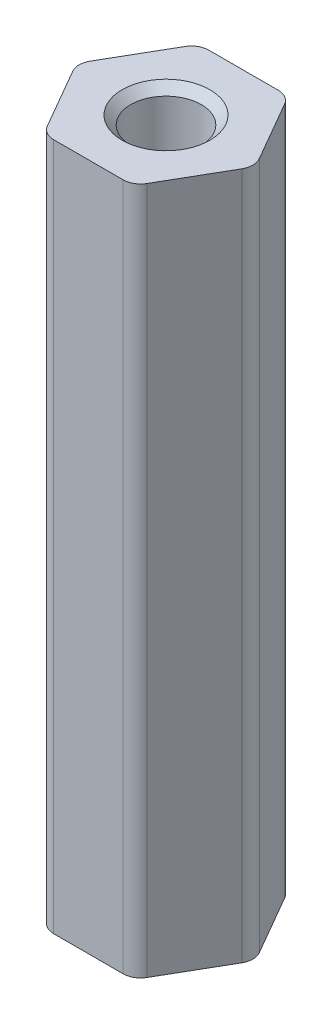
ISO-10303-21;
HEADER;
FILE_DESCRIPTION(('STEP AP214'),'2;1');
FILE_NAME('part.step','',(''),(''),'','','');
FILE_SCHEMA(('AUTOMOTIVE_DESIGN { 1 0 10303 214 1 1 1 1 }'));
ENDSEC;
DATA;
#1=APPLICATION_CONTEXT('core data for automotive mechanical design processes');
#2=APPLICATION_PROTOCOL_DEFINITION('international standard','automotive_design',2000,#1);
#3=PRODUCT_CONTEXT('',#1,'mechanical');
#4=PRODUCT('Part','Part','',(#3));
#5=PRODUCT_RELATED_PRODUCT_CATEGORY('part','',(#4));
#6=PRODUCT_DEFINITION_FORMATION('','',#4);
#7=PRODUCT_DEFINITION_CONTEXT('part definition',#1,'design');
#8=PRODUCT_DEFINITION('design','',#6,#7);
#9=PRODUCT_DEFINITION_SHAPE('','',#8);
#10=(LENGTH_UNIT() NAMED_UNIT(*) SI_UNIT(.MILLI.,.METRE.));
#11=(NAMED_UNIT(*) PLANE_ANGLE_UNIT() SI_UNIT($,.RADIAN.));
#12=(NAMED_UNIT(*) SI_UNIT($,.STERADIAN.) SOLID_ANGLE_UNIT());
#13=UNCERTAINTY_MEASURE_WITH_UNIT(LENGTH_MEASURE(1.E-05),#10,'distance_accuracy_value','');
#14=(GEOMETRIC_REPRESENTATION_CONTEXT(3) GLOBAL_UNCERTAINTY_ASSIGNED_CONTEXT((#13)) GLOBAL_UNIT_ASSIGNED_CONTEXT((#10,
#11,#12)) REPRESENTATION_CONTEXT('',''));
#15=CARTESIAN_POINT('',(0.,0.,0.));
#16=DIRECTION('',(0.,0.,1.));
#17=DIRECTION('',(1.,0.,0.));
#18=AXIS2_PLACEMENT_3D('',#15,#16,#17);
#19=CARTESIAN_POINT('',(-2.6035,19.9898,0.));
#20=DIRECTION('',(-0.866025403784438,0.,-0.500000000000001));
#21=DIRECTION('',(-0.500000000000001,0.,0.866025403784438));
#22=AXIS2_PLACEMENT_3D('',#19,#20,#21);
#23=PLANE('',#22);
#24=DIRECTION('',(0.500000000000001,0.,-0.866025403784438));
#25=VECTOR('',#24,1.);
#26=CARTESIAN_POINT('',(-2.6035,0.,0.));
#27=LINE('',#26,#25);
#28=CARTESIAN_POINT('',(-2.45685303162583,0.,-0.254000000000001));
#29=VERTEX_POINT('',#28);
#30=CARTESIAN_POINT('',(-1.44839696837416,0.,-2.00069713875279));
#31=VERTEX_POINT('',#30);
#32=EDGE_CURVE('E215',#29,#31,#27,.T.);
#33=ORIENTED_EDGE('',*,*,#32,.F.);
#34=DIRECTION('',(0.,-1.,0.));
#35=VECTOR('',#34,1.);
#36=CARTESIAN_POINT('',(-2.45685303162583,19.9898,-0.254000000000001));
#37=LINE('',#36,#35);
#38=CARTESIAN_POINT('',(-2.45685303162583,19.9898,-0.254000000000001));
#39=VERTEX_POINT('',#38);
#40=EDGE_CURVE('E170',#29,#39,#37,.F.);
#41=ORIENTED_EDGE('',*,*,#40,.T.);
#42=DIRECTION('',(0.500000000000001,0.,-0.866025403784438));
#43=VECTOR('',#42,1.);
#44=CARTESIAN_POINT('',(-2.6035,19.9898,0.));
#45=LINE('',#44,#43);
#46=CARTESIAN_POINT('',(-1.44839696837416,19.9898,-2.00069713875279));
#47=VERTEX_POINT('',#46);
#48=EDGE_CURVE('E147',#39,#47,#45,.T.);
#49=ORIENTED_EDGE('',*,*,#48,.T.);
#50=DIRECTION('',(0.,-1.,0.));
#51=VECTOR('',#50,1.);
#52=CARTESIAN_POINT('',(-1.44839696837416,19.9898,-2.00069713875279));
#53=LINE('',#52,#51);
#54=EDGE_CURVE('E167',#47,#31,#53,.T.);
#55=ORIENTED_EDGE('',*,*,#54,.T.);
#56=EDGE_LOOP('',(#33,#41,#49,#55));
#57=FACE_BOUND('',#56,.T.);
#58=ADVANCED_FACE('F36',(#57),#23,.T.);
#59=CARTESIAN_POINT('',(-1.30174999999999,19.9898,2.25469713875279));
#60=DIRECTION('',(-0.866025403784438,0.,0.500000000000001));
#61=DIRECTION('',(0.500000000000001,0.,0.866025403784438));
#62=AXIS2_PLACEMENT_3D('',#59,#60,#61);
#63=PLANE('',#62);
#64=DIRECTION('',(-0.500000000000001,0.,-0.866025403784438));
#65=VECTOR('',#64,1.);
#66=CARTESIAN_POINT('',(-1.30174999999999,19.9898,2.25469713875279));
#67=LINE('',#66,#65);
#68=CARTESIAN_POINT('',(-1.44839696837416,19.9898,2.00069713875279));
#69=VERTEX_POINT('',#68);
#70=CARTESIAN_POINT('',(-2.45685303162583,19.9898,0.254));
#71=VERTEX_POINT('',#70);
#72=EDGE_CURVE('E152',#69,#71,#67,.T.);
#73=ORIENTED_EDGE('',*,*,#72,.T.);
#74=DIRECTION('',(0.,-1.,0.));
#75=VECTOR('',#74,1.);
#76=CARTESIAN_POINT('',(-2.45685303162583,19.9898,0.254));
#77=LINE('',#76,#75);
#78=CARTESIAN_POINT('',(-2.45685303162583,0.,0.254));
#79=VERTEX_POINT('',#78);
#80=EDGE_CURVE('E146',#71,#79,#77,.T.);
#81=ORIENTED_EDGE('',*,*,#80,.T.);
#82=DIRECTION('',(-0.500000000000001,0.,-0.866025403784438));
#83=VECTOR('',#82,1.);
#84=CARTESIAN_POINT('',(-1.30174999999999,0.,2.25469713875279));
#85=LINE('',#84,#83);
#86=CARTESIAN_POINT('',(-1.44839696837416,0.,2.00069713875279));
#87=VERTEX_POINT('',#86);
#88=EDGE_CURVE('E129',#87,#79,#85,.T.);
#89=ORIENTED_EDGE('',*,*,#88,.F.);
#90=DIRECTION('',(0.,-1.,0.));
#91=VECTOR('',#90,1.);
#92=CARTESIAN_POINT('',(-1.44839696837416,19.9898,2.00069713875279));
#93=LINE('',#92,#91);
#94=EDGE_CURVE('E143',#87,#69,#93,.F.);
#95=ORIENTED_EDGE('',*,*,#94,.T.);
#96=EDGE_LOOP('',(#73,#81,#89,#95));
#97=FACE_BOUND('',#96,.T.);
#98=ADVANCED_FACE('F142',(#97),#63,.T.);
#99=CARTESIAN_POINT('',(1.30175,19.9898,2.25469713875279));
#100=DIRECTION('',(0.,0.,1.));
#101=DIRECTION('',(1.,0.,0.));
#102=AXIS2_PLACEMENT_3D('',#99,#100,#101);
#103=PLANE('',#102);
#104=DIRECTION('',(-1.,0.,0.));
#105=VECTOR('',#104,1.);
#106=CARTESIAN_POINT('',(1.30175,19.9898,2.25469713875279));
#107=LINE('',#106,#105);
#108=CARTESIAN_POINT('',(1.00845606325167,19.9898,2.25469713875279));
#109=VERTEX_POINT('',#108);
#110=CARTESIAN_POINT('',(-1.00845606325166,19.9898,2.25469713875279));
#111=VERTEX_POINT('',#110);
#112=EDGE_CURVE('E156',#109,#111,#107,.T.);
#113=ORIENTED_EDGE('',*,*,#112,.T.);
#114=DIRECTION('',(0.,-1.,0.));
#115=VECTOR('',#114,1.);
#116=CARTESIAN_POINT('',(-1.00845606325166,19.9898,2.25469713875279));
#117=LINE('',#116,#115);
#118=CARTESIAN_POINT('',(-1.00845606325166,0.,2.25469713875279));
#119=VERTEX_POINT('',#118);
#120=EDGE_CURVE('E184',#111,#119,#117,.T.);
#121=ORIENTED_EDGE('',*,*,#120,.T.);
#122=DIRECTION('',(-1.,0.,0.));
#123=VECTOR('',#122,1.);
#124=CARTESIAN_POINT('',(1.30175,0.,2.25469713875279));
#125=LINE('',#124,#123);
#126=CARTESIAN_POINT('',(1.00845606325167,0.,2.25469713875279));
#127=VERTEX_POINT('',#126);
#128=EDGE_CURVE('E131',#127,#119,#125,.T.);
#129=ORIENTED_EDGE('',*,*,#128,.F.);
#130=DIRECTION('',(0.,-1.,0.));
#131=VECTOR('',#130,1.);
#132=CARTESIAN_POINT('',(1.00845606325167,19.9898,2.25469713875279));
#133=LINE('',#132,#131);
#134=EDGE_CURVE('E182',#127,#109,#133,.F.);
#135=ORIENTED_EDGE('',*,*,#134,.T.);
#136=EDGE_LOOP('',(#113,#121,#129,#135));
#137=FACE_BOUND('',#136,.T.);
#138=ADVANCED_FACE('F269',(#137),#103,.T.);
#139=CARTESIAN_POINT('',(2.6035,19.9898,0.));
#140=DIRECTION('',(0.866025403784438,0.,0.500000000000001));
#141=DIRECTION('',(0.500000000000001,0.,-0.866025403784438));
#142=AXIS2_PLACEMENT_3D('',#139,#140,#141);
#143=PLANE('',#142);
#144=DIRECTION('',(-0.500000000000001,0.,0.866025403784438));
#145=VECTOR('',#144,1.);
#146=CARTESIAN_POINT('',(2.6035,0.,0.));
#147=LINE('',#146,#145);
#148=CARTESIAN_POINT('',(2.45685303162583,0.,0.254));
#149=VERTEX_POINT('',#148);
#150=CARTESIAN_POINT('',(1.44839696837416,0.,2.00069713875279));
#151=VERTEX_POINT('',#150);
#152=EDGE_CURVE('E201',#149,#151,#147,.T.);
#153=ORIENTED_EDGE('',*,*,#152,.F.);
#154=DIRECTION('',(0.,-1.,0.));
#155=VECTOR('',#154,1.);
#156=CARTESIAN_POINT('',(2.45685303162583,19.9898,0.254));
#157=LINE('',#156,#155);
#158=CARTESIAN_POINT('',(2.45685303162583,19.9898,0.254));
#159=VERTEX_POINT('',#158);
#160=EDGE_CURVE('E11',#149,#159,#157,.F.);
#161=ORIENTED_EDGE('',*,*,#160,.T.);
#162=DIRECTION('',(-0.500000000000001,0.,0.866025403784438));
#163=VECTOR('',#162,1.);
#164=CARTESIAN_POINT('',(2.6035,19.9898,0.));
#165=LINE('',#164,#163);
#166=CARTESIAN_POINT('',(1.44839696837416,19.9898,2.00069713875279));
#167=VERTEX_POINT('',#166);
#168=EDGE_CURVE('E204',#159,#167,#165,.T.);
#169=ORIENTED_EDGE('',*,*,#168,.T.);
#170=DIRECTION('',(0.,-1.,0.));
#171=VECTOR('',#170,1.);
#172=CARTESIAN_POINT('',(1.44839696837416,19.9898,2.00069713875279));
#173=LINE('',#172,#171);
#174=EDGE_CURVE('E44',#167,#151,#173,.T.);
#175=ORIENTED_EDGE('',*,*,#174,.T.);
#176=EDGE_LOOP('',(#153,#161,#169,#175));
#177=FACE_BOUND('',#176,.T.);
#178=ADVANCED_FACE('F200',(#177),#143,.T.);
#179=CARTESIAN_POINT('',(1.30174999999999,19.9898,-2.25469713875279));
#180=DIRECTION('',(0.866025403784438,0.,-0.500000000000001));
#181=DIRECTION('',(-0.500000000000001,0.,-0.866025403784438));
#182=AXIS2_PLACEMENT_3D('',#179,#180,#181);
#183=PLANE('',#182);
#184=DIRECTION('',(0.500000000000001,0.,0.866025403784438));
#185=VECTOR('',#184,1.);
#186=CARTESIAN_POINT('',(1.30174999999999,0.,-2.25469713875279));
#187=LINE('',#186,#185);
#188=CARTESIAN_POINT('',(1.44839696837416,0.,-2.00069713875279));
#189=VERTEX_POINT('',#188);
#190=CARTESIAN_POINT('',(2.45685303162583,0.,-0.254));
#191=VERTEX_POINT('',#190);
#192=EDGE_CURVE('E208',#189,#191,#187,.T.);
#193=ORIENTED_EDGE('',*,*,#192,.F.);
#194=DIRECTION('',(0.,-1.,0.));
#195=VECTOR('',#194,1.);
#196=CARTESIAN_POINT('',(1.44839696837416,19.9898,-2.00069713875279));
#197=LINE('',#196,#195);
#198=CARTESIAN_POINT('',(1.44839696837416,19.9898,-2.00069713875279));
#199=VERTEX_POINT('',#198);
#200=EDGE_CURVE('E193',#189,#199,#197,.F.);
#201=ORIENTED_EDGE('',*,*,#200,.T.);
#202=DIRECTION('',(0.500000000000001,0.,0.866025403784438));
#203=VECTOR('',#202,1.);
#204=CARTESIAN_POINT('',(1.30174999999999,19.9898,-2.25469713875279));
#205=LINE('',#204,#203);
#206=CARTESIAN_POINT('',(2.45685303162583,19.9898,-0.254));
#207=VERTEX_POINT('',#206);
#208=EDGE_CURVE('E222',#199,#207,#205,.T.);
#209=ORIENTED_EDGE('',*,*,#208,.T.);
#210=DIRECTION('',(0.,-1.,0.));
#211=VECTOR('',#210,1.);
#212=CARTESIAN_POINT('',(2.45685303162583,19.9898,-0.254000000000001));
#213=LINE('',#212,#211);
#214=EDGE_CURVE('E190',#207,#191,#213,.T.);
#215=ORIENTED_EDGE('',*,*,#214,.T.);
#216=EDGE_LOOP('',(#193,#201,#209,#215));
#217=FACE_BOUND('',#216,.T.);
#218=ADVANCED_FACE('F261',(#217),#183,.T.);
#219=CARTESIAN_POINT('',(-1.30175,19.9898,-2.25469713875279));
#220=DIRECTION('',(0.,0.,-1.));
#221=DIRECTION('',(-1.,0.,0.));
#222=AXIS2_PLACEMENT_3D('',#219,#220,#221);
#223=PLANE('',#222);
#224=DIRECTION('',(1.,0.,0.));
#225=VECTOR('',#224,1.);
#226=CARTESIAN_POINT('',(-1.30175,0.,-2.25469713875279));
#227=LINE('',#226,#225);
#228=CARTESIAN_POINT('',(-1.00845606325167,0.,-2.25469713875279));
#229=VERTEX_POINT('',#228);
#230=CARTESIAN_POINT('',(1.00845606325166,0.,-2.25469713875279));
#231=VERTEX_POINT('',#230);
#232=EDGE_CURVE('E210',#229,#231,#227,.T.);
#233=ORIENTED_EDGE('',*,*,#232,.F.);
#234=DIRECTION('',(0.,-1.,0.));
#235=VECTOR('',#234,1.);
#236=CARTESIAN_POINT('',(-1.00845606325167,19.9898,-2.25469713875279));
#237=LINE('',#236,#235);
#238=CARTESIAN_POINT('',(-1.00845606325167,19.9898,-2.25469713875279));
#239=VERTEX_POINT('',#238);
#240=EDGE_CURVE('E58',#229,#239,#237,.F.);
#241=ORIENTED_EDGE('',*,*,#240,.T.);
#242=DIRECTION('',(1.,0.,0.));
#243=VECTOR('',#242,1.);
#244=CARTESIAN_POINT('',(-1.30175,19.9898,-2.25469713875279));
#245=LINE('',#244,#243);
#246=CARTESIAN_POINT('',(1.00845606325166,19.9898,-2.25469713875279));
#247=VERTEX_POINT('',#246);
#248=EDGE_CURVE('E225',#239,#247,#245,.T.);
#249=ORIENTED_EDGE('',*,*,#248,.T.);
#250=DIRECTION('',(0.,-1.,0.));
#251=VECTOR('',#250,1.);
#252=CARTESIAN_POINT('',(1.00845606325166,19.9898,-2.25469713875279));
#253=LINE('',#252,#251);
#254=EDGE_CURVE('E186',#247,#231,#253,.T.);
#255=ORIENTED_EDGE('',*,*,#254,.T.);
#256=EDGE_LOOP('',(#233,#241,#249,#255));
#257=FACE_BOUND('',#256,.T.);
#258=ADVANCED_FACE('F242',(#257),#223,.T.);
#259=CARTESIAN_POINT('',(0.,19.9898,0.));
#260=DIRECTION('',(0.,-1.,0.));
#261=DIRECTION('',(0.,0.,-1.));
#262=AXIS2_PLACEMENT_3D('',#259,#260,#261);
#263=PLANE('',#262);
#264=CARTESIAN_POINT('',(0.,19.9898,0.));
#265=DIRECTION('',(0.,1.,0.));
#266=DIRECTION('',(0.,0.,1.));
#267=AXIS2_PLACEMENT_3D('',#264,#265,#266);
#268=CIRCLE('',#267,1.275);
#269=CARTESIAN_POINT('',(0.,19.9898,1.275));
#270=VERTEX_POINT('',#269);
#271=EDGE_CURVE('E234',#270,#270,#268,.T.);
#272=ORIENTED_EDGE('',*,*,#271,.F.);
#273=EDGE_LOOP('',(#272));
#274=FACE_BOUND('',#273,.T.);
#275=ORIENTED_EDGE('',*,*,#48,.F.);
#276=CARTESIAN_POINT('',(-2.01691212650334,19.9898,0.));
#277=DIRECTION('',(0.,-1.,0.));
#278=DIRECTION('',(0.,0.,-1.));
#279=AXIS2_PLACEMENT_3D('',#276,#277,#278);
#280=CIRCLE('',#279,0.508);
#281=EDGE_CURVE('E180',#39,#71,#280,.F.);
#282=ORIENTED_EDGE('',*,*,#281,.T.);
#283=ORIENTED_EDGE('',*,*,#72,.F.);
#284=CARTESIAN_POINT('',(-1.00845606325166,19.9898,1.74669713875279));
#285=DIRECTION('',(0.,-1.,0.));
#286=DIRECTION('',(0.,0.,-1.));
#287=AXIS2_PLACEMENT_3D('',#284,#285,#286);
#288=CIRCLE('',#287,0.508);
#289=EDGE_CURVE('E151',#69,#111,#288,.F.);
#290=ORIENTED_EDGE('',*,*,#289,.T.);
#291=ORIENTED_EDGE('',*,*,#112,.F.);
#292=CARTESIAN_POINT('',(1.00845606325167,19.9898,1.74669713875279));
#293=DIRECTION('',(0.,-1.,0.));
#294=DIRECTION('',(0.,0.,-1.));
#295=AXIS2_PLACEMENT_3D('',#292,#293,#294);
#296=CIRCLE('',#295,0.508);
#297=EDGE_CURVE('E172',#109,#167,#296,.F.);
#298=ORIENTED_EDGE('',*,*,#297,.T.);
#299=ORIENTED_EDGE('',*,*,#168,.F.);
#300=CARTESIAN_POINT('',(2.01691212650334,19.9898,0.));
#301=DIRECTION('',(0.,-1.,0.));
#302=DIRECTION('',(0.,0.,-1.));
#303=AXIS2_PLACEMENT_3D('',#300,#301,#302);
#304=CIRCLE('',#303,0.508);
#305=EDGE_CURVE('E174',#159,#207,#304,.F.);
#306=ORIENTED_EDGE('',*,*,#305,.T.);
#307=ORIENTED_EDGE('',*,*,#208,.F.);
#308=CARTESIAN_POINT('',(1.00845606325166,19.9898,-1.74669713875279));
#309=DIRECTION('',(0.,-1.,0.));
#310=DIRECTION('',(0.,0.,-1.));
#311=AXIS2_PLACEMENT_3D('',#308,#309,#310);
#312=CIRCLE('',#311,0.508);
#313=EDGE_CURVE('E51',#199,#247,#312,.F.);
#314=ORIENTED_EDGE('',*,*,#313,.T.);
#315=ORIENTED_EDGE('',*,*,#248,.F.);
#316=CARTESIAN_POINT('',(-1.00845606325167,19.9898,-1.74669713875279));
#317=DIRECTION('',(0.,-1.,0.));
#318=DIRECTION('',(0.,0.,-1.));
#319=AXIS2_PLACEMENT_3D('',#316,#317,#318);
#320=CIRCLE('',#319,0.508);
#321=EDGE_CURVE('E177',#239,#47,#320,.F.);
#322=ORIENTED_EDGE('',*,*,#321,.T.);
#323=EDGE_LOOP('',(#275,#282,#283,#290,#291,#298,#299,#306,#307,#314,#315,#322));
#324=FACE_BOUND('',#323,.T.);
#325=ADVANCED_FACE('F240',(#274,#324),#263,.F.);
#326=CARTESIAN_POINT('',(0.,0.,0.));
#327=DIRECTION('',(0.,-1.,0.));
#328=DIRECTION('',(0.,0.,-1.));
#329=AXIS2_PLACEMENT_3D('',#326,#327,#328);
#330=PLANE('',#329);
#331=CARTESIAN_POINT('',(0.,0.,0.));
#332=DIRECTION('',(0.,1.,0.));
#333=DIRECTION('',(0.,0.,1.));
#334=AXIS2_PLACEMENT_3D('',#331,#332,#333);
#335=CIRCLE('',#334,1.02499999999999);
#336=CARTESIAN_POINT('',(0.,0.,1.02499999999999));
#337=VERTEX_POINT('',#336);
#338=EDGE_CURVE('E217',#337,#337,#335,.T.);
#339=ORIENTED_EDGE('',*,*,#338,.T.);
#340=EDGE_LOOP('',(#339));
#341=FACE_BOUND('',#340,.T.);
#342=ORIENTED_EDGE('',*,*,#88,.T.);
#343=CARTESIAN_POINT('',(-2.01691212650334,0.,0.));
#344=DIRECTION('',(0.,-1.,0.));
#345=DIRECTION('',(0.,0.,-1.));
#346=AXIS2_PLACEMENT_3D('',#343,#344,#345);
#347=CIRCLE('',#346,0.508);
#348=EDGE_CURVE('E136',#79,#29,#347,.T.);
#349=ORIENTED_EDGE('',*,*,#348,.T.);
#350=ORIENTED_EDGE('',*,*,#32,.T.);
#351=CARTESIAN_POINT('',(-1.00845606325167,0.,-1.74669713875279));
#352=DIRECTION('',(0.,-1.,0.));
#353=DIRECTION('',(0.,0.,-1.));
#354=AXIS2_PLACEMENT_3D('',#351,#352,#353);
#355=CIRCLE('',#354,0.508);
#356=EDGE_CURVE('E137',#31,#229,#355,.T.);
#357=ORIENTED_EDGE('',*,*,#356,.T.);
#358=ORIENTED_EDGE('',*,*,#232,.T.);
#359=CARTESIAN_POINT('',(1.00845606325166,0.,-1.74669713875279));
#360=DIRECTION('',(0.,-1.,0.));
#361=DIRECTION('',(0.,0.,-1.));
#362=AXIS2_PLACEMENT_3D('',#359,#360,#361);
#363=CIRCLE('',#362,0.508);
#364=EDGE_CURVE('E163',#231,#189,#363,.T.);
#365=ORIENTED_EDGE('',*,*,#364,.T.);
#366=ORIENTED_EDGE('',*,*,#192,.T.);
#367=CARTESIAN_POINT('',(2.01691212650334,0.,0.));
#368=DIRECTION('',(0.,-1.,0.));
#369=DIRECTION('',(0.,0.,-1.));
#370=AXIS2_PLACEMENT_3D('',#367,#368,#369);
#371=CIRCLE('',#370,0.508);
#372=EDGE_CURVE('E161',#191,#149,#371,.T.);
#373=ORIENTED_EDGE('',*,*,#372,.T.);
#374=ORIENTED_EDGE('',*,*,#152,.T.);
#375=CARTESIAN_POINT('',(1.00845606325167,0.,1.74669713875279));
#376=DIRECTION('',(0.,-1.,0.));
#377=DIRECTION('',(0.,0.,-1.));
#378=AXIS2_PLACEMENT_3D('',#375,#376,#377);
#379=CIRCLE('',#378,0.508);
#380=EDGE_CURVE('E154',#151,#127,#379,.T.);
#381=ORIENTED_EDGE('',*,*,#380,.T.);
#382=ORIENTED_EDGE('',*,*,#128,.T.);
#383=CARTESIAN_POINT('',(-1.00845606325166,0.,1.74669713875279));
#384=DIRECTION('',(0.,-1.,0.));
#385=DIRECTION('',(0.,0.,-1.));
#386=AXIS2_PLACEMENT_3D('',#383,#384,#385);
#387=CIRCLE('',#386,0.508);
#388=EDGE_CURVE('E126',#119,#87,#387,.T.);
#389=ORIENTED_EDGE('',*,*,#388,.T.);
#390=EDGE_LOOP('',(#342,#349,#350,#357,#358,#365,#366,#373,#374,#381,#382,#389));
#391=FACE_BOUND('',#390,.T.);
#392=ADVANCED_FACE('F128',(#341,#391),#330,.T.);
#393=CARTESIAN_POINT('',(-2.01691212650334,19.9898,0.));
#394=DIRECTION('',(0.,-1.,0.));
#395=DIRECTION('',(0.,0.,-1.));
#396=AXIS2_PLACEMENT_3D('',#393,#394,#395);
#397=CYLINDRICAL_SURFACE('',#396,0.508);
#398=ORIENTED_EDGE('',*,*,#281,.F.);
#399=ORIENTED_EDGE('',*,*,#40,.F.);
#400=ORIENTED_EDGE('',*,*,#348,.F.);
#401=ORIENTED_EDGE('',*,*,#80,.F.);
#402=EDGE_LOOP('',(#398,#399,#400,#401));
#403=FACE_BOUND('',#402,.T.);
#404=ADVANCED_FACE('F251',(#403),#397,.T.);
#405=CARTESIAN_POINT('',(-1.00845606325166,19.9898,1.74669713875279));
#406=DIRECTION('',(0.,-1.,0.));
#407=DIRECTION('',(0.,0.,-1.));
#408=AXIS2_PLACEMENT_3D('',#405,#406,#407);
#409=CYLINDRICAL_SURFACE('',#408,0.508);
#410=ORIENTED_EDGE('',*,*,#289,.F.);
#411=ORIENTED_EDGE('',*,*,#94,.F.);
#412=ORIENTED_EDGE('',*,*,#388,.F.);
#413=ORIENTED_EDGE('',*,*,#120,.F.);
#414=EDGE_LOOP('',(#410,#411,#412,#413));
#415=FACE_BOUND('',#414,.T.);
#416=ADVANCED_FACE('F150',(#415),#409,.T.);
#417=CARTESIAN_POINT('',(-1.00845606325167,19.9898,-1.74669713875279));
#418=DIRECTION('',(0.,-1.,0.));
#419=DIRECTION('',(0.,0.,-1.));
#420=AXIS2_PLACEMENT_3D('',#417,#418,#419);
#421=CYLINDRICAL_SURFACE('',#420,0.508);
#422=ORIENTED_EDGE('',*,*,#321,.F.);
#423=ORIENTED_EDGE('',*,*,#240,.F.);
#424=ORIENTED_EDGE('',*,*,#356,.F.);
#425=ORIENTED_EDGE('',*,*,#54,.F.);
#426=EDGE_LOOP('',(#422,#423,#424,#425));
#427=FACE_BOUND('',#426,.T.);
#428=ADVANCED_FACE('F254',(#427),#421,.T.);
#429=CARTESIAN_POINT('',(1.00845606325166,19.9898,-1.74669713875279));
#430=DIRECTION('',(0.,-1.,0.));
#431=DIRECTION('',(0.,0.,-1.));
#432=AXIS2_PLACEMENT_3D('',#429,#430,#431);
#433=CYLINDRICAL_SURFACE('',#432,0.508);
#434=ORIENTED_EDGE('',*,*,#313,.F.);
#435=ORIENTED_EDGE('',*,*,#200,.F.);
#436=ORIENTED_EDGE('',*,*,#364,.F.);
#437=ORIENTED_EDGE('',*,*,#254,.F.);
#438=EDGE_LOOP('',(#434,#435,#436,#437));
#439=FACE_BOUND('',#438,.T.);
#440=ADVANCED_FACE('F257',(#439),#433,.T.);
#441=CARTESIAN_POINT('',(2.01691212650334,19.9898,0.));
#442=DIRECTION('',(0.,-1.,0.));
#443=DIRECTION('',(0.,0.,-1.));
#444=AXIS2_PLACEMENT_3D('',#441,#442,#443);
#445=CYLINDRICAL_SURFACE('',#444,0.508);
#446=ORIENTED_EDGE('',*,*,#305,.F.);
#447=ORIENTED_EDGE('',*,*,#160,.F.);
#448=ORIENTED_EDGE('',*,*,#372,.F.);
#449=ORIENTED_EDGE('',*,*,#214,.F.);
#450=EDGE_LOOP('',(#446,#447,#448,#449));
#451=FACE_BOUND('',#450,.T.);
#452=ADVANCED_FACE('F265',(#451),#445,.T.);
#453=CARTESIAN_POINT('',(1.00845606325167,19.9898,1.74669713875279));
#454=DIRECTION('',(0.,-1.,0.));
#455=DIRECTION('',(0.,0.,-1.));
#456=AXIS2_PLACEMENT_3D('',#453,#454,#455);
#457=CYLINDRICAL_SURFACE('',#456,0.508);
#458=ORIENTED_EDGE('',*,*,#297,.F.);
#459=ORIENTED_EDGE('',*,*,#134,.F.);
#460=ORIENTED_EDGE('',*,*,#380,.F.);
#461=ORIENTED_EDGE('',*,*,#174,.F.);
#462=EDGE_LOOP('',(#458,#459,#460,#461));
#463=FACE_BOUND('',#462,.T.);
#464=ADVANCED_FACE('F38',(#463),#457,.T.);
#465=CARTESIAN_POINT('',(0.,19.9898,0.));
#466=DIRECTION('',(0.,1.,0.));
#467=DIRECTION('',(0.,0.,1.));
#468=AXIS2_PLACEMENT_3D('',#465,#466,#467);
#469=CYLINDRICAL_SURFACE('',#468,1.02499999999999);
#470=ORIENTED_EDGE('',*,*,#338,.F.);
#471=EDGE_LOOP('',(#470));
#472=FACE_BOUND('',#471,.T.);
#473=CARTESIAN_POINT('',(0.,19.7398,0.));
#474=DIRECTION('',(0.,1.,0.));
#475=DIRECTION('',(0.,0.,1.));
#476=AXIS2_PLACEMENT_3D('',#473,#474,#475);
#477=CIRCLE('',#476,1.02499999999999);
#478=CARTESIAN_POINT('',(0.,19.7398,1.02499999999999));
#479=VERTEX_POINT('',#478);
#480=EDGE_CURVE('E231',#479,#479,#477,.T.);
#481=ORIENTED_EDGE('',*,*,#480,.T.);
#482=EDGE_LOOP('',(#481));
#483=FACE_BOUND('',#482,.T.);
#484=ADVANCED_FACE('F296',(#472,#483),#469,.F.);
#485=CARTESIAN_POINT('',(0.,19.9898,0.));
#486=DIRECTION('',(0.,1.,0.));
#487=DIRECTION('',(0.,0.,1.));
#488=AXIS2_PLACEMENT_3D('',#485,#486,#487);
#489=CONICAL_SURFACE('',#488,1.275,0.785398163397461);
#490=ORIENTED_EDGE('',*,*,#480,.F.);
#491=EDGE_LOOP('',(#490));
#492=FACE_BOUND('',#491,.T.);
#493=ORIENTED_EDGE('',*,*,#271,.T.);
#494=EDGE_LOOP('',(#493));
#495=FACE_BOUND('',#494,.T.);
#496=ADVANCED_FACE('F238',(#492,#495),#489,.F.);
#497=CLOSED_SHELL('',(#58,#98,#138,#178,#218,#258,#325,#392,#404,#416,#428,#440,#452,#464,#484,#496));
#498=MANIFOLD_SOLID_BREP('B2',#497);
#499=ADVANCED_BREP_SHAPE_REPRESENTATION('',(#18,#498),#14);
#500=SHAPE_DEFINITION_REPRESENTATION(#9,#499);
ENDSEC;
END-ISO-10303-21;
